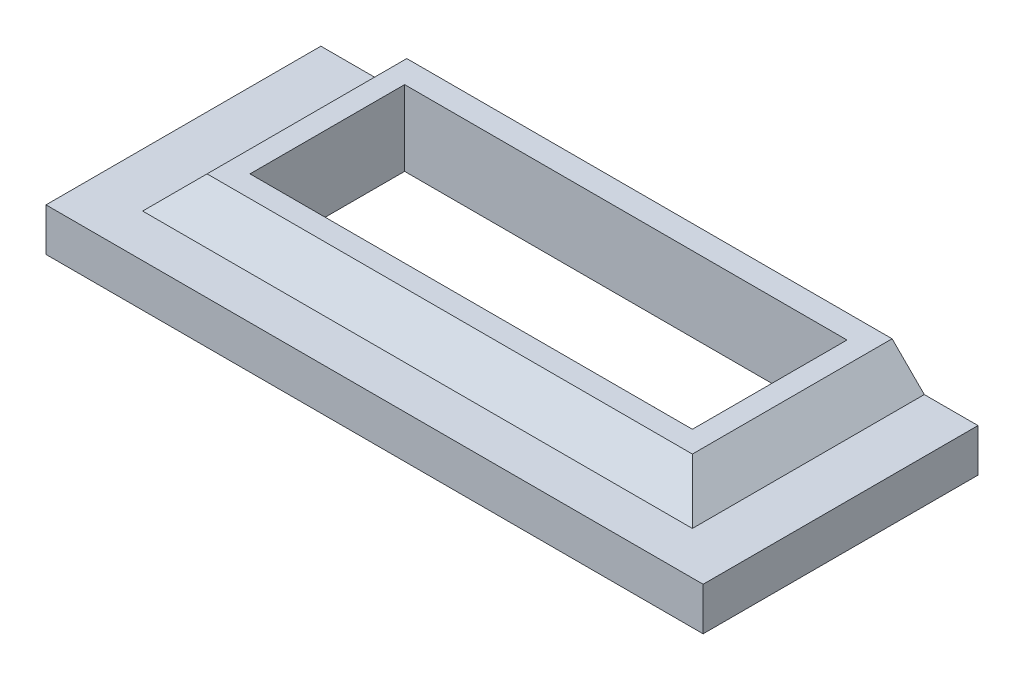
ISO-10303-21;
HEADER;
FILE_DESCRIPTION(('STEP AP214'),'2;1');
FILE_NAME('part.step','',(''),(''),'','','');
FILE_SCHEMA(('AUTOMOTIVE_DESIGN { 1 0 10303 214 1 1 1 1 }'));
ENDSEC;
DATA;
#1=APPLICATION_CONTEXT('core data for automotive mechanical design processes');
#2=APPLICATION_PROTOCOL_DEFINITION('international standard','automotive_design',2000,#1);
#3=PRODUCT_CONTEXT('',#1,'mechanical');
#4=PRODUCT('Part','Part','',(#3));
#5=PRODUCT_RELATED_PRODUCT_CATEGORY('part','',(#4));
#6=PRODUCT_DEFINITION_FORMATION('','',#4);
#7=PRODUCT_DEFINITION_CONTEXT('part definition',#1,'design');
#8=PRODUCT_DEFINITION('design','',#6,#7);
#9=PRODUCT_DEFINITION_SHAPE('','',#8);
#10=(LENGTH_UNIT() NAMED_UNIT(*) SI_UNIT(.MILLI.,.METRE.));
#11=(NAMED_UNIT(*) PLANE_ANGLE_UNIT() SI_UNIT($,.RADIAN.));
#12=(NAMED_UNIT(*) SI_UNIT($,.STERADIAN.) SOLID_ANGLE_UNIT());
#13=UNCERTAINTY_MEASURE_WITH_UNIT(LENGTH_MEASURE(1.E-05),#10,'distance_accuracy_value','');
#14=(GEOMETRIC_REPRESENTATION_CONTEXT(3) GLOBAL_UNCERTAINTY_ASSIGNED_CONTEXT((#13)) GLOBAL_UNIT_ASSIGNED_CONTEXT((#10,
#11,#12)) REPRESENTATION_CONTEXT('',''));
#15=CARTESIAN_POINT('',(0.,0.,0.));
#16=DIRECTION('',(0.,0.,1.));
#17=DIRECTION('',(1.,0.,0.));
#18=AXIS2_PLACEMENT_3D('',#15,#16,#17);
#19=CARTESIAN_POINT('',(74.42,0.,0.));
#20=DIRECTION('',(-1.,0.,0.));
#21=DIRECTION('',(0.,0.,1.));
#22=AXIS2_PLACEMENT_3D('',#19,#20,#21);
#23=PLANE('',#22);
#24=DIRECTION('',(0.,0.,-1.));
#25=VECTOR('',#24,1.);
#26=CARTESIAN_POINT('',(74.42,-51.15,-19.8));
#27=LINE('',#26,#25);
#28=CARTESIAN_POINT('',(74.42,-51.15,-2.));
#29=VERTEX_POINT('',#28);
#30=CARTESIAN_POINT('',(74.42,-51.15,-14.8));
#31=VERTEX_POINT('',#30);
#32=EDGE_CURVE('E132',#29,#31,#27,.T.);
#33=ORIENTED_EDGE('',*,*,#32,.T.);
#34=DIRECTION('',(0.,-1.,0.));
#35=VECTOR('',#34,1.);
#36=CARTESIAN_POINT('',(74.42,0.,-14.8));
#37=LINE('',#36,#35);
#38=CARTESIAN_POINT('',(74.42,-49.15,-14.8));
#39=VERTEX_POINT('',#38);
#40=EDGE_CURVE('E167',#39,#31,#37,.T.);
#41=ORIENTED_EDGE('',*,*,#40,.F.);
#42=DIRECTION('',(0.,0.,-1.));
#43=VECTOR('',#42,1.);
#44=CARTESIAN_POINT('',(74.42,-49.15,-19.8));
#45=LINE('',#44,#43);
#46=CARTESIAN_POINT('',(74.42,-49.15,-2.));
#47=VERTEX_POINT('',#46);
#48=EDGE_CURVE('E143',#47,#39,#45,.T.);
#49=ORIENTED_EDGE('',*,*,#48,.F.);
#50=DIRECTION('',(0.,1.,0.));
#51=VECTOR('',#50,1.);
#52=CARTESIAN_POINT('',(74.42,0.,-2.));
#53=LINE('',#52,#51);
#54=EDGE_CURVE('E42',#29,#47,#53,.T.);
#55=ORIENTED_EDGE('',*,*,#54,.F.);
#56=EDGE_LOOP('',(#33,#41,#49,#55));
#57=FACE_BOUND('',#56,.T.);
#58=ADVANCED_FACE('F38',(#57),#23,.F.);
#59=CARTESIAN_POINT('',(43.82,0.,0.));
#60=DIRECTION('',(1.,0.,0.));
#61=DIRECTION('',(0.,0.,-1.));
#62=AXIS2_PLACEMENT_3D('',#59,#60,#61);
#63=PLANE('',#62);
#64=DIRECTION('',(0.,0.,1.));
#65=VECTOR('',#64,1.);
#66=CARTESIAN_POINT('',(43.82,-51.15,-19.8));
#67=LINE('',#66,#65);
#68=CARTESIAN_POINT('',(43.82,-51.15,-14.8));
#69=VERTEX_POINT('',#68);
#70=CARTESIAN_POINT('',(43.82,-51.15,-2.));
#71=VERTEX_POINT('',#70);
#72=EDGE_CURVE('E152',#69,#71,#67,.T.);
#73=ORIENTED_EDGE('',*,*,#72,.T.);
#74=DIRECTION('',(0.,-1.,0.));
#75=VECTOR('',#74,1.);
#76=CARTESIAN_POINT('',(43.82,0.,-2.));
#77=LINE('',#76,#75);
#78=CARTESIAN_POINT('',(43.82,-49.15,-2.));
#79=VERTEX_POINT('',#78);
#80=EDGE_CURVE('E149',#79,#71,#77,.T.);
#81=ORIENTED_EDGE('',*,*,#80,.F.);
#82=DIRECTION('',(0.,0.,1.));
#83=VECTOR('',#82,1.);
#84=CARTESIAN_POINT('',(43.82,-49.15,-19.8));
#85=LINE('',#84,#83);
#86=CARTESIAN_POINT('',(43.82,-49.15,-14.8));
#87=VERTEX_POINT('',#86);
#88=EDGE_CURVE('E168',#87,#79,#85,.T.);
#89=ORIENTED_EDGE('',*,*,#88,.F.);
#90=DIRECTION('',(0.,1.,0.));
#91=VECTOR('',#90,1.);
#92=CARTESIAN_POINT('',(43.82,0.,-14.8));
#93=LINE('',#92,#91);
#94=EDGE_CURVE('E164',#69,#87,#93,.T.);
#95=ORIENTED_EDGE('',*,*,#94,.F.);
#96=EDGE_LOOP('',(#73,#81,#89,#95));
#97=FACE_BOUND('',#96,.T.);
#98=ADVANCED_FACE('F231',(#97),#63,.F.);
#99=CARTESIAN_POINT('',(0.,0.,-2.));
#100=DIRECTION('',(0.,0.,-1.));
#101=DIRECTION('',(-1.,0.,0.));
#102=AXIS2_PLACEMENT_3D('',#99,#100,#101);
#103=PLANE('',#102);
#104=DIRECTION('',(1.,0.,0.));
#105=VECTOR('',#104,1.);
#106=CARTESIAN_POINT('',(-87.15,-51.15,-2.));
#107=LINE('',#106,#105);
#108=EDGE_CURVE('E138',#71,#29,#107,.T.);
#109=ORIENTED_EDGE('',*,*,#108,.T.);
#110=ORIENTED_EDGE('',*,*,#54,.T.);
#111=DIRECTION('',(1.,0.,0.));
#112=VECTOR('',#111,1.);
#113=CARTESIAN_POINT('',(-85.15,-49.15,-2.));
#114=LINE('',#113,#112);
#115=EDGE_CURVE('E157',#79,#47,#114,.T.);
#116=ORIENTED_EDGE('',*,*,#115,.F.);
#117=ORIENTED_EDGE('',*,*,#80,.T.);
#118=EDGE_LOOP('',(#109,#110,#116,#117));
#119=FACE_BOUND('',#118,.T.);
#120=ADVANCED_FACE('F40',(#119),#103,.F.);
#121=CARTESIAN_POINT('',(48.82,-27.3279927596016,-6.5));
#122=DIRECTION('',(0.,0.,-1.));
#123=DIRECTION('',(-1.,0.,0.));
#124=AXIS2_PLACEMENT_3D('',#121,#122,#123);
#125=PLANE('',#124);
#126=DIRECTION('',(0.,-1.,0.));
#127=VECTOR('',#126,1.);
#128=CARTESIAN_POINT('',(69.42,-27.3279927596016,-6.5));
#129=LINE('',#128,#127);
#130=CARTESIAN_POINT('',(69.42,-47.65,-6.5));
#131=VERTEX_POINT('',#130);
#132=CARTESIAN_POINT('',(69.42,-51.15,-6.5));
#133=VERTEX_POINT('',#132);
#134=EDGE_CURVE('E63',#131,#133,#129,.T.);
#135=ORIENTED_EDGE('',*,*,#134,.T.);
#136=DIRECTION('',(1.,0.,0.));
#137=VECTOR('',#136,1.);
#138=CARTESIAN_POINT('',(48.82,-51.15,-6.5));
#139=LINE('',#138,#137);
#140=CARTESIAN_POINT('',(48.82,-51.15,-6.5));
#141=VERTEX_POINT('',#140);
#142=EDGE_CURVE('E206',#141,#133,#139,.T.);
#143=ORIENTED_EDGE('',*,*,#142,.F.);
#144=DIRECTION('',(0.,-1.,0.));
#145=VECTOR('',#144,1.);
#146=CARTESIAN_POINT('',(48.82,-27.3279927596016,-6.5));
#147=LINE('',#146,#145);
#148=CARTESIAN_POINT('',(48.82,-47.65,-6.5));
#149=VERTEX_POINT('',#148);
#150=EDGE_CURVE('E193',#149,#141,#147,.T.);
#151=ORIENTED_EDGE('',*,*,#150,.F.);
#152=DIRECTION('',(-1.,0.,0.));
#153=VECTOR('',#152,1.);
#154=CARTESIAN_POINT('',(48.82,-47.65,-6.5));
#155=LINE('',#154,#153);
#156=EDGE_CURVE('E179',#131,#149,#155,.T.);
#157=ORIENTED_EDGE('',*,*,#156,.F.);
#158=EDGE_LOOP('',(#135,#143,#151,#157));
#159=FACE_BOUND('',#158,.T.);
#160=ADVANCED_FACE('F274',(#159),#125,.T.);
#161=CARTESIAN_POINT('',(48.82,-27.3279927596016,-6.5));
#162=DIRECTION('',(1.,0.,0.));
#163=DIRECTION('',(0.,0.,-1.));
#164=AXIS2_PLACEMENT_3D('',#161,#162,#163);
#165=PLANE('',#164);
#166=ORIENTED_EDGE('',*,*,#150,.T.);
#167=DIRECTION('',(0.,0.,1.));
#168=VECTOR('',#167,1.);
#169=CARTESIAN_POINT('',(48.82,-51.15,-6.5));
#170=LINE('',#169,#168);
#171=CARTESIAN_POINT('',(48.82,-51.15,-13.7));
#172=VERTEX_POINT('',#171);
#173=EDGE_CURVE('E209',#172,#141,#170,.T.);
#174=ORIENTED_EDGE('',*,*,#173,.F.);
#175=DIRECTION('',(0.,-1.,0.));
#176=VECTOR('',#175,1.);
#177=CARTESIAN_POINT('',(48.82,-27.3279927596016,-13.7));
#178=LINE('',#177,#176);
#179=CARTESIAN_POINT('',(48.82,-47.65,-13.7));
#180=VERTEX_POINT('',#179);
#181=EDGE_CURVE('E55',#180,#172,#178,.T.);
#182=ORIENTED_EDGE('',*,*,#181,.F.);
#183=DIRECTION('',(0.,0.,-1.));
#184=VECTOR('',#183,1.);
#185=CARTESIAN_POINT('',(48.82,-47.65,-13.7));
#186=LINE('',#185,#184);
#187=EDGE_CURVE('E170',#149,#180,#186,.T.);
#188=ORIENTED_EDGE('',*,*,#187,.F.);
#189=EDGE_LOOP('',(#166,#174,#182,#188));
#190=FACE_BOUND('',#189,.T.);
#191=ADVANCED_FACE('F278',(#190),#165,.T.);
#192=CARTESIAN_POINT('',(48.82,-27.3279927596016,-13.7));
#193=DIRECTION('',(0.,0.,1.));
#194=DIRECTION('',(1.,0.,0.));
#195=AXIS2_PLACEMENT_3D('',#192,#193,#194);
#196=PLANE('',#195);
#197=ORIENTED_EDGE('',*,*,#181,.T.);
#198=DIRECTION('',(-1.,0.,0.));
#199=VECTOR('',#198,1.);
#200=CARTESIAN_POINT('',(48.82,-51.15,-13.7));
#201=LINE('',#200,#199);
#202=CARTESIAN_POINT('',(69.42,-51.15,-13.7));
#203=VERTEX_POINT('',#202);
#204=EDGE_CURVE('E200',#203,#172,#201,.T.);
#205=ORIENTED_EDGE('',*,*,#204,.F.);
#206=DIRECTION('',(0.,-1.,0.));
#207=VECTOR('',#206,1.);
#208=CARTESIAN_POINT('',(69.42,-27.3279927596016,-13.7));
#209=LINE('',#208,#207);
#210=CARTESIAN_POINT('',(69.42,-47.65,-13.7));
#211=VERTEX_POINT('',#210);
#212=EDGE_CURVE('E197',#211,#203,#209,.T.);
#213=ORIENTED_EDGE('',*,*,#212,.F.);
#214=DIRECTION('',(1.,0.,0.));
#215=VECTOR('',#214,1.);
#216=CARTESIAN_POINT('',(69.42,-47.65,-13.7));
#217=LINE('',#216,#215);
#218=EDGE_CURVE('E173',#180,#211,#217,.T.);
#219=ORIENTED_EDGE('',*,*,#218,.F.);
#220=EDGE_LOOP('',(#197,#205,#213,#219));
#221=FACE_BOUND('',#220,.T.);
#222=ADVANCED_FACE('F284',(#221),#196,.T.);
#223=CARTESIAN_POINT('',(69.42,-27.3279927596016,-6.5));
#224=DIRECTION('',(-1.,0.,0.));
#225=DIRECTION('',(0.,0.,1.));
#226=AXIS2_PLACEMENT_3D('',#223,#224,#225);
#227=PLANE('',#226);
#228=ORIENTED_EDGE('',*,*,#212,.T.);
#229=DIRECTION('',(0.,0.,-1.));
#230=VECTOR('',#229,1.);
#231=CARTESIAN_POINT('',(69.42,-51.15,-6.5));
#232=LINE('',#231,#230);
#233=EDGE_CURVE('E203',#133,#203,#232,.T.);
#234=ORIENTED_EDGE('',*,*,#233,.F.);
#235=ORIENTED_EDGE('',*,*,#134,.F.);
#236=DIRECTION('',(0.,0.,1.));
#237=VECTOR('',#236,1.);
#238=CARTESIAN_POINT('',(69.42,-47.65,-6.5));
#239=LINE('',#238,#237);
#240=EDGE_CURVE('E176',#211,#131,#239,.T.);
#241=ORIENTED_EDGE('',*,*,#240,.F.);
#242=EDGE_LOOP('',(#228,#234,#235,#241));
#243=FACE_BOUND('',#242,.T.);
#244=ADVANCED_FACE('F286',(#243),#227,.T.);
#245=CARTESIAN_POINT('',(-85.15,-49.15,-4.));
#246=DIRECTION('',(0.,-0.707106781186547,-0.707106781186547));
#247=DIRECTION('',(-1.,0.,0.));
#248=AXIS2_PLACEMENT_3D('',#245,#246,#247);
#249=PLANE('',#248);
#250=DIRECTION('',(0.577350269189626,-0.577350269189626,0.577350269189626));
#251=VECTOR('',#250,1.);
#252=CARTESIAN_POINT('',(66.6533333333333,-43.8833333333333,-9.26666666666666));
#253=LINE('',#252,#251);
#254=CARTESIAN_POINT('',(71.92,-49.15,-3.99999999999999));
#255=VERTEX_POINT('',#254);
#256=CARTESIAN_POINT('',(70.42,-47.65,-5.5));
#257=VERTEX_POINT('',#256);
#258=EDGE_CURVE('E47',#255,#257,#253,.F.);
#259=ORIENTED_EDGE('',*,*,#258,.T.);
#260=DIRECTION('',(-1.,0.,0.));
#261=VECTOR('',#260,1.);
#262=CARTESIAN_POINT('',(70.42,-47.65,-5.5));
#263=LINE('',#262,#261);
#264=CARTESIAN_POINT('',(47.82,-47.65,-5.5));
#265=VERTEX_POINT('',#264);
#266=EDGE_CURVE('E185',#257,#265,#263,.T.);
#267=ORIENTED_EDGE('',*,*,#266,.T.);
#268=DIRECTION('',(-0.577350269189629,-0.577350269189624,0.577350269189624));
#269=VECTOR('',#268,1.);
#270=CARTESIAN_POINT('',(2.4966666666662,-92.9733333333334,39.8233333333334));
#271=LINE('',#270,#269);
#272=CARTESIAN_POINT('',(46.32,-49.15,-3.99999999999999));
#273=VERTEX_POINT('',#272);
#274=EDGE_CURVE('E11',#273,#265,#271,.F.);
#275=ORIENTED_EDGE('',*,*,#274,.F.);
#276=DIRECTION('',(-1.,0.,0.));
#277=VECTOR('',#276,1.);
#278=CARTESIAN_POINT('',(-85.15,-49.15,-4.));
#279=LINE('',#278,#277);
#280=EDGE_CURVE('E214',#255,#273,#279,.T.);
#281=ORIENTED_EDGE('',*,*,#280,.F.);
#282=EDGE_LOOP('',(#259,#267,#275,#281));
#283=FACE_BOUND('',#282,.T.);
#284=ADVANCED_FACE('F243',(#283),#249,.F.);
#285=CARTESIAN_POINT('',(71.92,-49.15,-19.8));
#286=DIRECTION('',(-0.707106781186547,-0.707106781186547,0.));
#287=DIRECTION('',(0.,0.,1.));
#288=AXIS2_PLACEMENT_3D('',#285,#286,#287);
#289=PLANE('',#288);
#290=DIRECTION('',(0.707106781186548,-0.707106781186548,0.));
#291=VECTOR('',#290,1.);
#292=CARTESIAN_POINT('',(11.385,11.385,-14.8));
#293=LINE('',#292,#291);
#294=CARTESIAN_POINT('',(70.42,-47.65,-14.8));
#295=VERTEX_POINT('',#294);
#296=CARTESIAN_POINT('',(71.92,-49.15,-14.8));
#297=VERTEX_POINT('',#296);
#298=EDGE_CURVE('E166',#295,#297,#293,.T.);
#299=ORIENTED_EDGE('',*,*,#298,.F.);
#300=DIRECTION('',(0.,0.,1.));
#301=VECTOR('',#300,1.);
#302=CARTESIAN_POINT('',(70.42,-47.65,-14.8));
#303=LINE('',#302,#301);
#304=EDGE_CURVE('E182',#295,#257,#303,.T.);
#305=ORIENTED_EDGE('',*,*,#304,.T.);
#306=ORIENTED_EDGE('',*,*,#258,.F.);
#307=DIRECTION('',(0.,0.,1.));
#308=VECTOR('',#307,1.);
#309=CARTESIAN_POINT('',(71.92,-49.15,-19.8));
#310=LINE('',#309,#308);
#311=EDGE_CURVE('E212',#297,#255,#310,.T.);
#312=ORIENTED_EDGE('',*,*,#311,.F.);
#313=EDGE_LOOP('',(#299,#305,#306,#312));
#314=FACE_BOUND('',#313,.T.);
#315=ADVANCED_FACE('F241',(#314),#289,.F.);
#316=CARTESIAN_POINT('',(0.,-47.65,0.));
#317=DIRECTION('',(0.,-1.,0.));
#318=DIRECTION('',(0.,0.,-1.));
#319=AXIS2_PLACEMENT_3D('',#316,#317,#318);
#320=PLANE('',#319);
#321=ORIENTED_EDGE('',*,*,#156,.T.);
#322=ORIENTED_EDGE('',*,*,#187,.T.);
#323=ORIENTED_EDGE('',*,*,#218,.T.);
#324=ORIENTED_EDGE('',*,*,#240,.T.);
#325=EDGE_LOOP('',(#321,#322,#323,#324));
#326=FACE_BOUND('',#325,.T.);
#327=ORIENTED_EDGE('',*,*,#304,.F.);
#328=DIRECTION('',(1.,0.,0.));
#329=VECTOR('',#328,1.);
#330=CARTESIAN_POINT('',(70.42,-47.65,-14.8));
#331=LINE('',#330,#329);
#332=CARTESIAN_POINT('',(47.82,-47.65,-14.8));
#333=VERTEX_POINT('',#332);
#334=EDGE_CURVE('E163',#333,#295,#331,.T.);
#335=ORIENTED_EDGE('',*,*,#334,.F.);
#336=DIRECTION('',(0.,0.,-1.));
#337=VECTOR('',#336,1.);
#338=CARTESIAN_POINT('',(47.82,-47.65,-14.8));
#339=LINE('',#338,#337);
#340=EDGE_CURVE('E188',#265,#333,#339,.T.);
#341=ORIENTED_EDGE('',*,*,#340,.F.);
#342=ORIENTED_EDGE('',*,*,#266,.F.);
#343=EDGE_LOOP('',(#327,#335,#341,#342));
#344=FACE_BOUND('',#343,.T.);
#345=ADVANCED_FACE('F249',(#326,#344),#320,.F.);
#346=CARTESIAN_POINT('',(46.32,-49.15,-19.7999999999999));
#347=DIRECTION('',(0.707106781186545,-0.70710678118655,0.));
#348=DIRECTION('',(0.,0.,-1.));
#349=AXIS2_PLACEMENT_3D('',#346,#347,#348);
#350=PLANE('',#349);
#351=ORIENTED_EDGE('',*,*,#274,.T.);
#352=ORIENTED_EDGE('',*,*,#340,.T.);
#353=DIRECTION('',(0.70710678118655,0.707106781186545,0.));
#354=VECTOR('',#353,1.);
#355=CARTESIAN_POINT('',(47.7349999999999,-47.7350000000002,-14.8));
#356=LINE('',#355,#354);
#357=CARTESIAN_POINT('',(46.32,-49.15,-14.8));
#358=VERTEX_POINT('',#357);
#359=EDGE_CURVE('E219',#358,#333,#356,.T.);
#360=ORIENTED_EDGE('',*,*,#359,.F.);
#361=DIRECTION('',(0.,0.,-1.));
#362=VECTOR('',#361,1.);
#363=CARTESIAN_POINT('',(46.32,-49.15,-19.7999999999999));
#364=LINE('',#363,#362);
#365=EDGE_CURVE('E216',#273,#358,#364,.T.);
#366=ORIENTED_EDGE('',*,*,#365,.F.);
#367=EDGE_LOOP('',(#351,#352,#360,#366));
#368=FACE_BOUND('',#367,.T.);
#369=ADVANCED_FACE('F246',(#368),#350,.F.);
#370=CARTESIAN_POINT('',(-87.15,-51.15,-19.8));
#371=DIRECTION('',(0.,-1.,0.));
#372=DIRECTION('',(0.,0.,-1.));
#373=AXIS2_PLACEMENT_3D('',#370,#371,#372);
#374=PLANE('',#373);
#375=ORIENTED_EDGE('',*,*,#32,.F.);
#376=ORIENTED_EDGE('',*,*,#108,.F.);
#377=ORIENTED_EDGE('',*,*,#72,.F.);
#378=DIRECTION('',(-1.,0.,0.));
#379=VECTOR('',#378,1.);
#380=CARTESIAN_POINT('',(-87.15,-51.15,-14.8));
#381=LINE('',#380,#379);
#382=EDGE_CURVE('E140',#31,#69,#381,.T.);
#383=ORIENTED_EDGE('',*,*,#382,.F.);
#384=EDGE_LOOP('',(#375,#376,#377,#383));
#385=FACE_BOUND('',#384,.T.);
#386=ORIENTED_EDGE('',*,*,#233,.T.);
#387=ORIENTED_EDGE('',*,*,#204,.T.);
#388=ORIENTED_EDGE('',*,*,#173,.T.);
#389=ORIENTED_EDGE('',*,*,#142,.T.);
#390=EDGE_LOOP('',(#386,#387,#388,#389));
#391=FACE_BOUND('',#390,.T.);
#392=ADVANCED_FACE('F134',(#385,#391),#374,.T.);
#393=CARTESIAN_POINT('',(-85.15,-49.15,-19.8));
#394=DIRECTION('',(0.,-1.,0.));
#395=DIRECTION('',(0.,0.,-1.));
#396=AXIS2_PLACEMENT_3D('',#393,#394,#395);
#397=PLANE('',#396);
#398=ORIENTED_EDGE('',*,*,#115,.T.);
#399=ORIENTED_EDGE('',*,*,#48,.T.);
#400=DIRECTION('',(-1.,0.,0.));
#401=VECTOR('',#400,1.);
#402=CARTESIAN_POINT('',(-85.15,-49.15,-14.8));
#403=LINE('',#402,#401);
#404=EDGE_CURVE('E161',#39,#297,#403,.T.);
#405=ORIENTED_EDGE('',*,*,#404,.T.);
#406=ORIENTED_EDGE('',*,*,#311,.T.);
#407=ORIENTED_EDGE('',*,*,#280,.T.);
#408=ORIENTED_EDGE('',*,*,#365,.T.);
#409=EDGE_CURVE('E158',#358,#87,#403,.T.);
#410=ORIENTED_EDGE('',*,*,#409,.T.);
#411=ORIENTED_EDGE('',*,*,#88,.T.);
#412=EDGE_LOOP('',(#398,#399,#405,#406,#407,#408,#410,#411));
#413=FACE_BOUND('',#412,.T.);
#414=ADVANCED_FACE('F227',(#413),#397,.F.);
#415=CARTESIAN_POINT('',(0.,0.,-14.8));
#416=DIRECTION('',(0.,0.,1.));
#417=DIRECTION('',(1.,0.,0.));
#418=AXIS2_PLACEMENT_3D('',#415,#416,#417);
#419=PLANE('',#418);
#420=ORIENTED_EDGE('',*,*,#404,.F.);
#421=ORIENTED_EDGE('',*,*,#40,.T.);
#422=ORIENTED_EDGE('',*,*,#382,.T.);
#423=ORIENTED_EDGE('',*,*,#94,.T.);
#424=ORIENTED_EDGE('',*,*,#409,.F.);
#425=ORIENTED_EDGE('',*,*,#359,.T.);
#426=ORIENTED_EDGE('',*,*,#334,.T.);
#427=ORIENTED_EDGE('',*,*,#298,.T.);
#428=EDGE_LOOP('',(#420,#421,#422,#423,#424,#425,#426,#427));
#429=FACE_BOUND('',#428,.T.);
#430=ADVANCED_FACE('F234',(#429),#419,.F.);
#431=CLOSED_SHELL('',(#58,#98,#120,#160,#191,#222,#244,#284,#315,#345,#369,#392,#414,#430));
#432=MANIFOLD_SOLID_BREP('B2',#431);
#433=ADVANCED_BREP_SHAPE_REPRESENTATION('',(#18,#432),#14);
#434=SHAPE_DEFINITION_REPRESENTATION(#9,#433);
ENDSEC;
END-ISO-10303-21;
